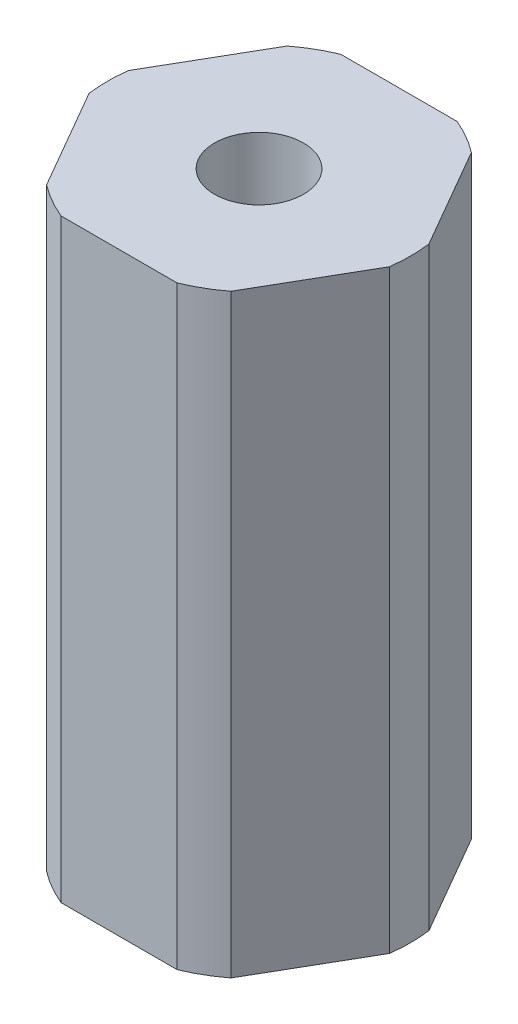
ISO-10303-21;
HEADER;
FILE_DESCRIPTION(('STEP AP214'),'2;1');
FILE_NAME('part.step','',(''),(''),'','','');
FILE_SCHEMA(('AUTOMOTIVE_DESIGN { 1 0 10303 214 1 1 1 1 }'));
ENDSEC;
DATA;
#1=APPLICATION_CONTEXT('core data for automotive mechanical design processes');
#2=APPLICATION_PROTOCOL_DEFINITION('international standard','automotive_design',2000,#1);
#3=PRODUCT_CONTEXT('',#1,'mechanical');
#4=PRODUCT('Part','Part','',(#3));
#5=PRODUCT_RELATED_PRODUCT_CATEGORY('part','',(#4));
#6=PRODUCT_DEFINITION_FORMATION('','',#4);
#7=PRODUCT_DEFINITION_CONTEXT('part definition',#1,'design');
#8=PRODUCT_DEFINITION('design','',#6,#7);
#9=PRODUCT_DEFINITION_SHAPE('','',#8);
#10=(LENGTH_UNIT() NAMED_UNIT(*) SI_UNIT(.MILLI.,.METRE.));
#11=(NAMED_UNIT(*) PLANE_ANGLE_UNIT() SI_UNIT($,.RADIAN.));
#12=(NAMED_UNIT(*) SI_UNIT($,.STERADIAN.) SOLID_ANGLE_UNIT());
#13=UNCERTAINTY_MEASURE_WITH_UNIT(LENGTH_MEASURE(1.E-05),#10,'distance_accuracy_value','');
#14=(GEOMETRIC_REPRESENTATION_CONTEXT(3) GLOBAL_UNCERTAINTY_ASSIGNED_CONTEXT((#13)) GLOBAL_UNIT_ASSIGNED_CONTEXT((#10,
#11,#12)) REPRESENTATION_CONTEXT('',''));
#15=CARTESIAN_POINT('',(0.,0.,0.));
#16=DIRECTION('',(0.,0.,1.));
#17=DIRECTION('',(1.,0.,0.));
#18=AXIS2_PLACEMENT_3D('',#15,#16,#17);
#19=CARTESIAN_POINT('',(5.49926131403119,26.9875,3.175));
#20=DIRECTION('',(0.866025403784439,0.,0.5));
#21=DIRECTION('',(0.5,0.,-0.866025403784439));
#22=AXIS2_PLACEMENT_3D('',#19,#20,#21);
#23=PLANE('',#22);
#24=DIRECTION('',(-0.5,0.,0.866025403784439));
#25=VECTOR('',#24,1.);
#26=CARTESIAN_POINT('',(5.49926131403119,26.9875,3.175));
#27=LINE('',#26,#25);
#28=CARTESIAN_POINT('',(6.81675182633099,26.9875,0.893039494206794));
#29=VERTEX_POINT('',#28);
#30=CARTESIAN_POINT('',(4.18177080173138,26.9875,5.45696050579321));
#31=VERTEX_POINT('',#30);
#32=EDGE_CURVE('E141',#29,#31,#27,.T.);
#33=ORIENTED_EDGE('',*,*,#32,.T.);
#34=DIRECTION('',(0.,-1.,0.));
#35=VECTOR('',#34,1.);
#36=CARTESIAN_POINT('',(4.18177080173138,34.0457433137087,5.45696050579321));
#37=LINE('',#36,#35);
#38=CARTESIAN_POINT('',(4.18177080173138,0.,5.45696050579321));
#39=VERTEX_POINT('',#38);
#40=EDGE_CURVE('E188',#31,#39,#37,.T.);
#41=ORIENTED_EDGE('',*,*,#40,.T.);
#42=DIRECTION('',(-0.5,0.,0.866025403784439));
#43=VECTOR('',#42,1.);
#44=CARTESIAN_POINT('',(5.49926131403119,0.,3.175));
#45=LINE('',#44,#43);
#46=CARTESIAN_POINT('',(6.81675182633099,0.,0.893039494206794));
#47=VERTEX_POINT('',#46);
#48=EDGE_CURVE('E131',#47,#39,#45,.T.);
#49=ORIENTED_EDGE('',*,*,#48,.F.);
#50=DIRECTION('',(0.,-1.,0.));
#51=VECTOR('',#50,1.);
#52=CARTESIAN_POINT('',(6.81675182633099,34.0457433137087,0.893039494206789));
#53=LINE('',#52,#51);
#54=EDGE_CURVE('E179',#47,#29,#53,.F.);
#55=ORIENTED_EDGE('',*,*,#54,.T.);
#56=EDGE_LOOP('',(#33,#41,#49,#55));
#57=FACE_BOUND('',#56,.T.);
#58=ADVANCED_FACE('F17',(#57),#23,.T.);
#59=CARTESIAN_POINT('',(0.,26.9875,6.35));
#60=DIRECTION('',(0.,0.,1.));
#61=DIRECTION('',(1.,0.,0.));
#62=AXIS2_PLACEMENT_3D('',#59,#60,#61);
#63=PLANE('',#62);
#64=DIRECTION('',(-1.,0.,0.));
#65=VECTOR('',#64,1.);
#66=CARTESIAN_POINT('',(0.,26.9875,6.35));
#67=LINE('',#66,#65);
#68=CARTESIAN_POINT('',(2.63498102459961,26.9875,6.35));
#69=VERTEX_POINT('',#68);
#70=CARTESIAN_POINT('',(-2.63498102459961,26.9875,6.35));
#71=VERTEX_POINT('',#70);
#72=EDGE_CURVE('E169',#69,#71,#67,.T.);
#73=ORIENTED_EDGE('',*,*,#72,.T.);
#74=DIRECTION('',(0.,-1.,0.));
#75=VECTOR('',#74,1.);
#76=CARTESIAN_POINT('',(-2.63498102459961,34.0457433137087,6.35));
#77=LINE('',#76,#75);
#78=CARTESIAN_POINT('',(-2.63498102459961,0.,6.35));
#79=VERTEX_POINT('',#78);
#80=EDGE_CURVE('E35',#71,#79,#77,.T.);
#81=ORIENTED_EDGE('',*,*,#80,.T.);
#82=DIRECTION('',(-1.,0.,0.));
#83=VECTOR('',#82,1.);
#84=CARTESIAN_POINT('',(0.,0.,6.35));
#85=LINE('',#84,#83);
#86=CARTESIAN_POINT('',(2.63498102459961,0.,6.35));
#87=VERTEX_POINT('',#86);
#88=EDGE_CURVE('E148',#87,#79,#85,.T.);
#89=ORIENTED_EDGE('',*,*,#88,.F.);
#90=DIRECTION('',(0.,-1.,0.));
#91=VECTOR('',#90,1.);
#92=CARTESIAN_POINT('',(2.63498102459961,34.0457433137087,6.35));
#93=LINE('',#92,#91);
#94=EDGE_CURVE('E192',#87,#69,#93,.F.);
#95=ORIENTED_EDGE('',*,*,#94,.T.);
#96=EDGE_LOOP('',(#73,#81,#89,#95));
#97=FACE_BOUND('',#96,.T.);
#98=ADVANCED_FACE('F251',(#97),#63,.T.);
#99=CARTESIAN_POINT('',(-5.49926131403119,26.9875,3.175));
#100=DIRECTION('',(-0.866025403784439,0.,0.5));
#101=DIRECTION('',(0.5,0.,0.866025403784439));
#102=AXIS2_PLACEMENT_3D('',#99,#100,#101);
#103=PLANE('',#102);
#104=DIRECTION('',(-0.5,0.,-0.866025403784439));
#105=VECTOR('',#104,1.);
#106=CARTESIAN_POINT('',(-5.49926131403119,26.9875,3.175));
#107=LINE('',#106,#105);
#108=CARTESIAN_POINT('',(-4.18177080173138,26.9875,5.45696050579321));
#109=VERTEX_POINT('',#108);
#110=CARTESIAN_POINT('',(-6.81675182633099,26.9875,0.893039494206794));
#111=VERTEX_POINT('',#110);
#112=EDGE_CURVE('E165',#109,#111,#107,.T.);
#113=ORIENTED_EDGE('',*,*,#112,.T.);
#114=DIRECTION('',(0.,-1.,0.));
#115=VECTOR('',#114,1.);
#116=CARTESIAN_POINT('',(-6.81675182633099,34.0457433137087,0.893039494206789));
#117=LINE('',#116,#115);
#118=CARTESIAN_POINT('',(-6.81675182633099,0.,0.893039494206794));
#119=VERTEX_POINT('',#118);
#120=EDGE_CURVE('E43',#111,#119,#117,.T.);
#121=ORIENTED_EDGE('',*,*,#120,.T.);
#122=DIRECTION('',(-0.5,0.,-0.866025403784439));
#123=VECTOR('',#122,1.);
#124=CARTESIAN_POINT('',(-5.49926131403119,0.,3.175));
#125=LINE('',#124,#123);
#126=CARTESIAN_POINT('',(-4.18177080173138,0.,5.45696050579321));
#127=VERTEX_POINT('',#126);
#128=EDGE_CURVE('E143',#127,#119,#125,.T.);
#129=ORIENTED_EDGE('',*,*,#128,.F.);
#130=DIRECTION('',(0.,-1.,0.));
#131=VECTOR('',#130,1.);
#132=CARTESIAN_POINT('',(-4.18177080173138,34.0457433137087,5.45696050579321));
#133=LINE('',#132,#131);
#134=EDGE_CURVE('E199',#127,#109,#133,.F.);
#135=ORIENTED_EDGE('',*,*,#134,.T.);
#136=EDGE_LOOP('',(#113,#121,#129,#135));
#137=FACE_BOUND('',#136,.T.);
#138=ADVANCED_FACE('F256',(#137),#103,.T.);
#139=CARTESIAN_POINT('',(-5.49926131403119,26.9875,-3.175));
#140=DIRECTION('',(-0.866025403784439,0.,-0.5));
#141=DIRECTION('',(-0.5,0.,0.866025403784439));
#142=AXIS2_PLACEMENT_3D('',#139,#140,#141);
#143=PLANE('',#142);
#144=DIRECTION('',(0.5,0.,-0.866025403784439));
#145=VECTOR('',#144,1.);
#146=CARTESIAN_POINT('',(-5.49926131403119,26.9875,-3.175));
#147=LINE('',#146,#145);
#148=CARTESIAN_POINT('',(-6.81675182633099,26.9875,-0.893039494206793));
#149=VERTEX_POINT('',#148);
#150=CARTESIAN_POINT('',(-4.18177080173138,26.9875,-5.45696050579321));
#151=VERTEX_POINT('',#150);
#152=EDGE_CURVE('E161',#149,#151,#147,.T.);
#153=ORIENTED_EDGE('',*,*,#152,.T.);
#154=DIRECTION('',(0.,-1.,0.));
#155=VECTOR('',#154,1.);
#156=CARTESIAN_POINT('',(-4.18177080173138,34.0457433137087,-5.45696050579321));
#157=LINE('',#156,#155);
#158=CARTESIAN_POINT('',(-4.18177080173138,0.,-5.45696050579321));
#159=VERTEX_POINT('',#158);
#160=EDGE_CURVE('E211',#151,#159,#157,.T.);
#161=ORIENTED_EDGE('',*,*,#160,.T.);
#162=DIRECTION('',(0.5,0.,-0.866025403784439));
#163=VECTOR('',#162,1.);
#164=CARTESIAN_POINT('',(-5.49926131403119,0.,-3.175));
#165=LINE('',#164,#163);
#166=CARTESIAN_POINT('',(-6.81675182633099,0.,-0.893039494206793));
#167=VERTEX_POINT('',#166);
#168=EDGE_CURVE('E137',#167,#159,#165,.T.);
#169=ORIENTED_EDGE('',*,*,#168,.F.);
#170=DIRECTION('',(0.,-1.,0.));
#171=VECTOR('',#170,1.);
#172=CARTESIAN_POINT('',(-6.81675182633099,34.0457433137087,-0.893039494206793));
#173=LINE('',#172,#171);
#174=EDGE_CURVE('E206',#167,#149,#173,.F.);
#175=ORIENTED_EDGE('',*,*,#174,.T.);
#176=EDGE_LOOP('',(#153,#161,#169,#175));
#177=FACE_BOUND('',#176,.T.);
#178=ADVANCED_FACE('F309',(#177),#143,.T.);
#179=CARTESIAN_POINT('',(0.,26.9875,-6.35));
#180=DIRECTION('',(0.,0.,-1.));
#181=DIRECTION('',(-1.,0.,0.));
#182=AXIS2_PLACEMENT_3D('',#179,#180,#181);
#183=PLANE('',#182);
#184=DIRECTION('',(1.,0.,0.));
#185=VECTOR('',#184,1.);
#186=CARTESIAN_POINT('',(0.,26.9875,-6.35));
#187=LINE('',#186,#185);
#188=CARTESIAN_POINT('',(-2.63498102459961,26.9875,-6.35));
#189=VERTEX_POINT('',#188);
#190=CARTESIAN_POINT('',(2.63498102459961,26.9875,-6.35));
#191=VERTEX_POINT('',#190);
#192=EDGE_CURVE('E129',#189,#191,#187,.T.);
#193=ORIENTED_EDGE('',*,*,#192,.T.);
#194=DIRECTION('',(0.,-1.,0.));
#195=VECTOR('',#194,1.);
#196=CARTESIAN_POINT('',(2.63498102459961,34.0457433137087,-6.35));
#197=LINE('',#196,#195);
#198=CARTESIAN_POINT('',(2.63498102459961,0.,-6.35));
#199=VERTEX_POINT('',#198);
#200=EDGE_CURVE('E110',#191,#199,#197,.T.);
#201=ORIENTED_EDGE('',*,*,#200,.T.);
#202=DIRECTION('',(1.,0.,0.));
#203=VECTOR('',#202,1.);
#204=CARTESIAN_POINT('',(0.,0.,-6.35));
#205=LINE('',#204,#203);
#206=CARTESIAN_POINT('',(-2.63498102459961,0.,-6.35));
#207=VERTEX_POINT('',#206);
#208=EDGE_CURVE('E127',#207,#199,#205,.T.);
#209=ORIENTED_EDGE('',*,*,#208,.F.);
#210=DIRECTION('',(0.,-1.,0.));
#211=VECTOR('',#210,1.);
#212=CARTESIAN_POINT('',(-2.63498102459961,34.0457433137087,-6.35));
#213=LINE('',#212,#211);
#214=EDGE_CURVE('E215',#207,#189,#213,.F.);
#215=ORIENTED_EDGE('',*,*,#214,.T.);
#216=EDGE_LOOP('',(#193,#201,#209,#215));
#217=FACE_BOUND('',#216,.T.);
#218=ADVANCED_FACE('F125',(#217),#183,.T.);
#219=CARTESIAN_POINT('',(5.49926131403119,26.9875,-3.175));
#220=DIRECTION('',(0.866025403784438,0.,-0.5));
#221=DIRECTION('',(-0.5,0.,-0.866025403784439));
#222=AXIS2_PLACEMENT_3D('',#219,#220,#221);
#223=PLANE('',#222);
#224=DIRECTION('',(0.5,0.,0.866025403784439));
#225=VECTOR('',#224,1.);
#226=CARTESIAN_POINT('',(5.49926131403119,26.9875,-3.175));
#227=LINE('',#226,#225);
#228=CARTESIAN_POINT('',(4.18177080173138,26.9875,-5.45696050579321));
#229=VERTEX_POINT('',#228);
#230=CARTESIAN_POINT('',(6.81675182633099,26.9875,-0.893039494206797));
#231=VERTEX_POINT('',#230);
#232=EDGE_CURVE('E155',#229,#231,#227,.T.);
#233=ORIENTED_EDGE('',*,*,#232,.T.);
#234=DIRECTION('',(0.,-1.,0.));
#235=VECTOR('',#234,1.);
#236=CARTESIAN_POINT('',(6.81675182633099,34.0457433137087,-0.893039494206794));
#237=LINE('',#236,#235);
#238=CARTESIAN_POINT('',(6.81675182633099,0.,-0.893039494206797));
#239=VERTEX_POINT('',#238);
#240=EDGE_CURVE('E183',#231,#239,#237,.T.);
#241=ORIENTED_EDGE('',*,*,#240,.T.);
#242=DIRECTION('',(0.5,0.,0.866025403784439));
#243=VECTOR('',#242,1.);
#244=CARTESIAN_POINT('',(5.49926131403119,0.,-3.175));
#245=LINE('',#244,#243);
#246=CARTESIAN_POINT('',(4.18177080173138,0.,-5.45696050579321));
#247=VERTEX_POINT('',#246);
#248=EDGE_CURVE('E20',#247,#239,#245,.T.);
#249=ORIENTED_EDGE('',*,*,#248,.F.);
#250=DIRECTION('',(0.,-1.,0.));
#251=VECTOR('',#250,1.);
#252=CARTESIAN_POINT('',(4.18177080173138,34.0457433137087,-5.45696050579321));
#253=LINE('',#252,#251);
#254=EDGE_CURVE('E113',#247,#229,#253,.F.);
#255=ORIENTED_EDGE('',*,*,#254,.T.);
#256=EDGE_LOOP('',(#233,#241,#249,#255));
#257=FACE_BOUND('',#256,.T.);
#258=ADVANCED_FACE('F246',(#257),#223,.T.);
#259=CARTESIAN_POINT('',(0.,26.9875,0.));
#260=DIRECTION('',(0.,-1.,0.));
#261=DIRECTION('',(1.,0.,0.));
#262=AXIS2_PLACEMENT_3D('',#259,#260,#261);
#263=PLANE('',#262);
#264=CARTESIAN_POINT('',(0.,26.9875,0.));
#265=DIRECTION('',(0.,-1.,0.));
#266=DIRECTION('',(0.,0.,-1.));
#267=AXIS2_PLACEMENT_3D('',#264,#265,#266);
#268=CIRCLE('',#267,2.0193);
#269=CARTESIAN_POINT('',(0.,26.9875,-2.0193));
#270=VERTEX_POINT('',#269);
#271=EDGE_CURVE('E120',#270,#270,#268,.T.);
#272=ORIENTED_EDGE('',*,*,#271,.T.);
#273=EDGE_LOOP('',(#272));
#274=FACE_BOUND('',#273,.T.);
#275=CARTESIAN_POINT('',(0.,26.9875,0.));
#276=DIRECTION('',(0.,-1.,0.));
#277=DIRECTION('',(0.,0.,-1.));
#278=AXIS2_PLACEMENT_3D('',#275,#276,#277);
#279=CIRCLE('',#278,6.875);
#280=EDGE_CURVE('E178',#191,#229,#279,.T.);
#281=ORIENTED_EDGE('',*,*,#280,.F.);
#282=ORIENTED_EDGE('',*,*,#192,.F.);
#283=EDGE_CURVE('E119',#151,#189,#279,.T.);
#284=ORIENTED_EDGE('',*,*,#283,.F.);
#285=ORIENTED_EDGE('',*,*,#152,.F.);
#286=EDGE_CURVE('E210',#111,#149,#279,.T.);
#287=ORIENTED_EDGE('',*,*,#286,.F.);
#288=ORIENTED_EDGE('',*,*,#112,.F.);
#289=EDGE_CURVE('E203',#71,#109,#279,.T.);
#290=ORIENTED_EDGE('',*,*,#289,.F.);
#291=ORIENTED_EDGE('',*,*,#72,.F.);
#292=EDGE_CURVE('E196',#31,#69,#279,.T.);
#293=ORIENTED_EDGE('',*,*,#292,.F.);
#294=ORIENTED_EDGE('',*,*,#32,.F.);
#295=EDGE_CURVE('E187',#231,#29,#279,.T.);
#296=ORIENTED_EDGE('',*,*,#295,.F.);
#297=ORIENTED_EDGE('',*,*,#232,.F.);
#298=EDGE_LOOP('',(#281,#282,#284,#285,#287,#288,#290,#291,#293,#294,#296,#297));
#299=FACE_BOUND('',#298,.T.);
#300=ADVANCED_FACE('F235',(#274,#299),#263,.F.);
#301=CARTESIAN_POINT('',(0.,0.,0.));
#302=DIRECTION('',(0.,-1.,0.));
#303=DIRECTION('',(1.,0.,0.));
#304=AXIS2_PLACEMENT_3D('',#301,#302,#303);
#305=PLANE('',#304);
#306=CARTESIAN_POINT('',(0.,0.,0.));
#307=DIRECTION('',(0.,-1.,0.));
#308=DIRECTION('',(0.,0.,-1.));
#309=AXIS2_PLACEMENT_3D('',#306,#307,#308);
#310=CIRCLE('',#309,2.0193);
#311=CARTESIAN_POINT('',(0.,0.,-2.0193));
#312=VERTEX_POINT('',#311);
#313=EDGE_CURVE('E223',#312,#312,#310,.T.);
#314=ORIENTED_EDGE('',*,*,#313,.F.);
#315=EDGE_LOOP('',(#314));
#316=FACE_BOUND('',#315,.T.);
#317=ORIENTED_EDGE('',*,*,#208,.T.);
#318=CARTESIAN_POINT('',(0.,0.,0.));
#319=DIRECTION('',(0.,-1.,0.));
#320=DIRECTION('',(0.,0.,-1.));
#321=AXIS2_PLACEMENT_3D('',#318,#319,#320);
#322=CIRCLE('',#321,6.875);
#323=EDGE_CURVE('E28',#199,#247,#322,.T.);
#324=ORIENTED_EDGE('',*,*,#323,.T.);
#325=ORIENTED_EDGE('',*,*,#248,.T.);
#326=EDGE_CURVE('E11',#239,#47,#322,.T.);
#327=ORIENTED_EDGE('',*,*,#326,.T.);
#328=ORIENTED_EDGE('',*,*,#48,.T.);
#329=EDGE_CURVE('E26',#39,#87,#322,.T.);
#330=ORIENTED_EDGE('',*,*,#329,.T.);
#331=ORIENTED_EDGE('',*,*,#88,.T.);
#332=EDGE_CURVE('E404',#79,#127,#322,.T.);
#333=ORIENTED_EDGE('',*,*,#332,.T.);
#334=ORIENTED_EDGE('',*,*,#128,.T.);
#335=EDGE_CURVE('E406',#119,#167,#322,.T.);
#336=ORIENTED_EDGE('',*,*,#335,.T.);
#337=ORIENTED_EDGE('',*,*,#168,.T.);
#338=EDGE_CURVE('E121',#159,#207,#322,.T.);
#339=ORIENTED_EDGE('',*,*,#338,.T.);
#340=EDGE_LOOP('',(#317,#324,#325,#327,#328,#330,#331,#333,#334,#336,#337,#339));
#341=FACE_BOUND('',#340,.T.);
#342=ADVANCED_FACE('F134',(#316,#341),#305,.T.);
#343=CARTESIAN_POINT('',(0.,34.0457433137087,0.));
#344=DIRECTION('',(0.,-1.,0.));
#345=DIRECTION('',(0.,0.,-1.));
#346=AXIS2_PLACEMENT_3D('',#343,#344,#345);
#347=CYLINDRICAL_SURFACE('',#346,6.875);
#348=ORIENTED_EDGE('',*,*,#283,.T.);
#349=ORIENTED_EDGE('',*,*,#214,.F.);
#350=ORIENTED_EDGE('',*,*,#338,.F.);
#351=ORIENTED_EDGE('',*,*,#160,.F.);
#352=EDGE_LOOP('',(#348,#349,#350,#351));
#353=FACE_BOUND('',#352,.T.);
#354=ADVANCED_FACE('F234',(#353),#347,.T.);
#355=ORIENTED_EDGE('',*,*,#286,.T.);
#356=ORIENTED_EDGE('',*,*,#174,.F.);
#357=ORIENTED_EDGE('',*,*,#335,.F.);
#358=ORIENTED_EDGE('',*,*,#120,.F.);
#359=EDGE_LOOP('',(#355,#356,#357,#358));
#360=FACE_BOUND('',#359,.T.);
#361=ADVANCED_FACE('F243',(#360),#347,.T.);
#362=ORIENTED_EDGE('',*,*,#289,.T.);
#363=ORIENTED_EDGE('',*,*,#134,.F.);
#364=ORIENTED_EDGE('',*,*,#332,.F.);
#365=ORIENTED_EDGE('',*,*,#80,.F.);
#366=EDGE_LOOP('',(#362,#363,#364,#365));
#367=FACE_BOUND('',#366,.T.);
#368=ADVANCED_FACE('F278',(#367),#347,.T.);
#369=ORIENTED_EDGE('',*,*,#292,.T.);
#370=ORIENTED_EDGE('',*,*,#94,.F.);
#371=ORIENTED_EDGE('',*,*,#329,.F.);
#372=ORIENTED_EDGE('',*,*,#40,.F.);
#373=EDGE_LOOP('',(#369,#370,#371,#372));
#374=FACE_BOUND('',#373,.T.);
#375=ADVANCED_FACE('F274',(#374),#347,.T.);
#376=ORIENTED_EDGE('',*,*,#326,.F.);
#377=ORIENTED_EDGE('',*,*,#240,.F.);
#378=ORIENTED_EDGE('',*,*,#295,.T.);
#379=ORIENTED_EDGE('',*,*,#54,.F.);
#380=EDGE_LOOP('',(#376,#377,#378,#379));
#381=FACE_BOUND('',#380,.T.);
#382=ADVANCED_FACE('F272',(#381),#347,.T.);
#383=ORIENTED_EDGE('',*,*,#280,.T.);
#384=ORIENTED_EDGE('',*,*,#254,.F.);
#385=ORIENTED_EDGE('',*,*,#323,.F.);
#386=ORIENTED_EDGE('',*,*,#200,.F.);
#387=EDGE_LOOP('',(#383,#384,#385,#386));
#388=FACE_BOUND('',#387,.T.);
#389=ADVANCED_FACE('F109',(#388),#347,.T.);
#390=CARTESIAN_POINT('',(0.,32.8532284687422,0.));
#391=DIRECTION('',(0.,-1.,0.));
#392=DIRECTION('',(0.,0.,-1.));
#393=AXIS2_PLACEMENT_3D('',#390,#391,#392);
#394=CYLINDRICAL_SURFACE('',#393,2.0193);
#395=ORIENTED_EDGE('',*,*,#313,.T.);
#396=EDGE_LOOP('',(#395));
#397=FACE_BOUND('',#396,.T.);
#398=ORIENTED_EDGE('',*,*,#271,.F.);
#399=EDGE_LOOP('',(#398));
#400=FACE_BOUND('',#399,.T.);
#401=ADVANCED_FACE('F230',(#397,#400),#394,.F.);
#402=CLOSED_SHELL('',(#58,#98,#138,#178,#218,#258,#300,#342,#354,#361,#368,#375,#382,#389,#401));
#403=MANIFOLD_SOLID_BREP('B1',#402);
#404=ADVANCED_BREP_SHAPE_REPRESENTATION('',(#18,#403),#14);
#405=SHAPE_DEFINITION_REPRESENTATION(#9,#404);
ENDSEC;
END-ISO-10303-21;
